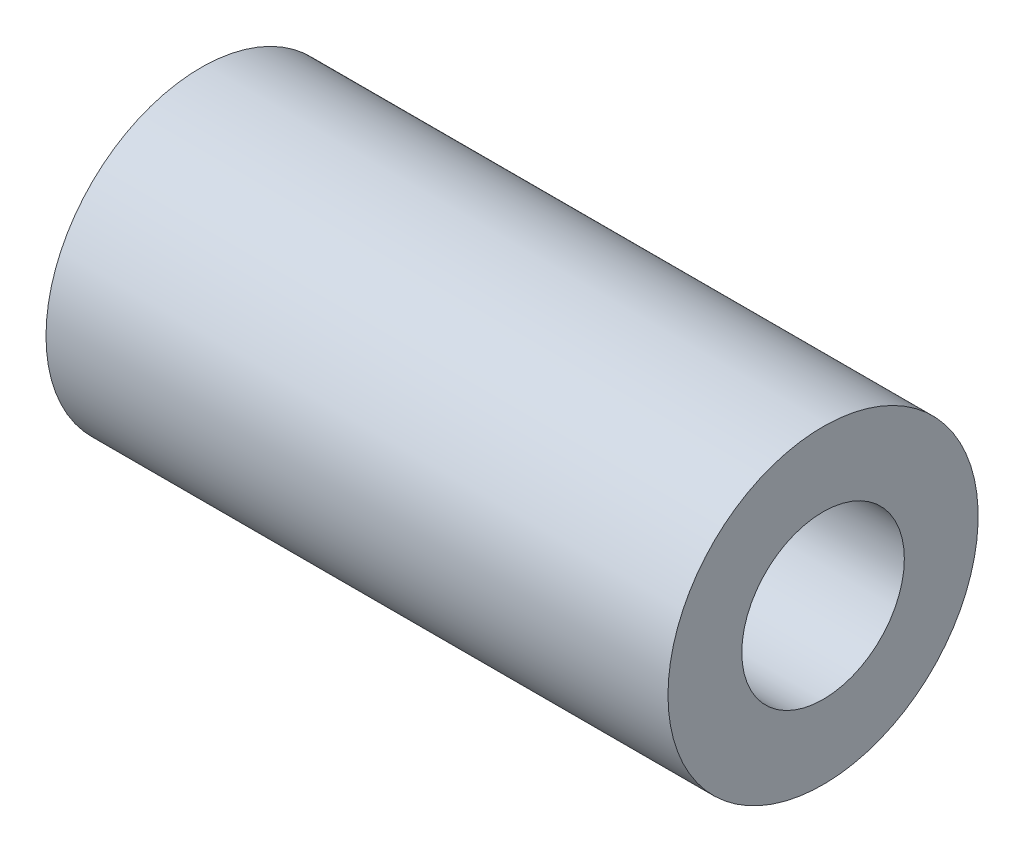
ISO-10303-21;
HEADER;
FILE_DESCRIPTION(('STEP AP214'),'2;1');
FILE_NAME('part.step','',(''),(''),'','','');
FILE_SCHEMA(('AUTOMOTIVE_DESIGN { 1 0 10303 214 1 1 1 1 }'));
ENDSEC;
DATA;
#1=APPLICATION_CONTEXT('core data for automotive mechanical design processes');
#2=APPLICATION_PROTOCOL_DEFINITION('international standard','automotive_design',2000,#1);
#3=PRODUCT_CONTEXT('',#1,'mechanical');
#4=PRODUCT('Part','Part','',(#3));
#5=PRODUCT_RELATED_PRODUCT_CATEGORY('part','',(#4));
#6=PRODUCT_DEFINITION_FORMATION('','',#4);
#7=PRODUCT_DEFINITION_CONTEXT('part definition',#1,'design');
#8=PRODUCT_DEFINITION('design','',#6,#7);
#9=PRODUCT_DEFINITION_SHAPE('','',#8);
#10=(LENGTH_UNIT() NAMED_UNIT(*) SI_UNIT(.MILLI.,.METRE.));
#11=(NAMED_UNIT(*) PLANE_ANGLE_UNIT() SI_UNIT($,.RADIAN.));
#12=(NAMED_UNIT(*) SI_UNIT($,.STERADIAN.) SOLID_ANGLE_UNIT());
#13=UNCERTAINTY_MEASURE_WITH_UNIT(LENGTH_MEASURE(1.E-05),#10,'distance_accuracy_value','');
#14=(GEOMETRIC_REPRESENTATION_CONTEXT(3) GLOBAL_UNCERTAINTY_ASSIGNED_CONTEXT((#13)) GLOBAL_UNIT_ASSIGNED_CONTEXT((#10,
#11,#12)) REPRESENTATION_CONTEXT('',''));
#15=CARTESIAN_POINT('',(0.,0.,0.));
#16=DIRECTION('',(0.,0.,1.));
#17=DIRECTION('',(1.,0.,0.));
#18=AXIS2_PLACEMENT_3D('',#15,#16,#17);
#19=CARTESIAN_POINT('',(9.525,0.,0.));
#20=DIRECTION('',(-1.,0.,0.));
#21=DIRECTION('',(0.,0.,1.));
#22=AXIS2_PLACEMENT_3D('',#19,#20,#21);
#23=CYLINDRICAL_SURFACE('',#22,2.4892);
#24=CARTESIAN_POINT('',(-9.525,0.,0.));
#25=DIRECTION('',(-1.,0.,0.));
#26=DIRECTION('',(0.,0.,1.));
#27=AXIS2_PLACEMENT_3D('',#24,#25,#26);
#28=CIRCLE('',#27,2.4892);
#29=CARTESIAN_POINT('',(-9.525,0.,2.4892));
#30=VERTEX_POINT('',#29);
#31=EDGE_CURVE('E27',#30,#30,#28,.T.);
#32=ORIENTED_EDGE('',*,*,#31,.T.);
#33=EDGE_LOOP('',(#32));
#34=FACE_BOUND('',#33,.T.);
#35=CARTESIAN_POINT('',(9.525,0.,0.));
#36=DIRECTION('',(-1.,0.,0.));
#37=DIRECTION('',(0.,0.,1.));
#38=AXIS2_PLACEMENT_3D('',#35,#36,#37);
#39=CIRCLE('',#38,2.4892);
#40=CARTESIAN_POINT('',(9.525,0.,2.4892));
#41=VERTEX_POINT('',#40);
#42=EDGE_CURVE('E18',#41,#41,#39,.T.);
#43=ORIENTED_EDGE('',*,*,#42,.F.);
#44=EDGE_LOOP('',(#43));
#45=FACE_BOUND('',#44,.T.);
#46=ADVANCED_FACE('F15',(#34,#45),#23,.F.);
#47=CARTESIAN_POINT('',(9.525,0.,0.));
#48=DIRECTION('',(1.,0.,0.));
#49=DIRECTION('',(0.,0.,-1.));
#50=AXIS2_PLACEMENT_3D('',#47,#48,#49);
#51=PLANE('',#50);
#52=ORIENTED_EDGE('',*,*,#42,.T.);
#53=EDGE_LOOP('',(#52));
#54=FACE_BOUND('',#53,.T.);
#55=CARTESIAN_POINT('',(9.525,0.,0.));
#56=DIRECTION('',(-1.,0.,0.));
#57=DIRECTION('',(0.,0.,1.));
#58=AXIS2_PLACEMENT_3D('',#55,#56,#57);
#59=CIRCLE('',#58,4.7498);
#60=CARTESIAN_POINT('',(9.525,0.,4.7498));
#61=VERTEX_POINT('',#60);
#62=EDGE_CURVE('E22',#61,#61,#59,.T.);
#63=ORIENTED_EDGE('',*,*,#62,.F.);
#64=EDGE_LOOP('',(#63));
#65=FACE_BOUND('',#64,.T.);
#66=ADVANCED_FACE('F35',(#54,#65),#51,.T.);
#67=CARTESIAN_POINT('',(-9.525,0.,0.));
#68=DIRECTION('',(1.,0.,0.));
#69=DIRECTION('',(0.,0.,-1.));
#70=AXIS2_PLACEMENT_3D('',#67,#68,#69);
#71=PLANE('',#70);
#72=ORIENTED_EDGE('',*,*,#31,.F.);
#73=EDGE_LOOP('',(#72));
#74=FACE_BOUND('',#73,.T.);
#75=CARTESIAN_POINT('',(-9.525,0.,0.));
#76=DIRECTION('',(-1.,0.,0.));
#77=DIRECTION('',(0.,0.,1.));
#78=AXIS2_PLACEMENT_3D('',#75,#76,#77);
#79=CIRCLE('',#78,4.7498);
#80=CARTESIAN_POINT('',(-9.525,0.,4.7498));
#81=VERTEX_POINT('',#80);
#82=EDGE_CURVE('E10',#81,#81,#79,.F.);
#83=ORIENTED_EDGE('',*,*,#82,.F.);
#84=EDGE_LOOP('',(#83));
#85=FACE_BOUND('',#84,.T.);
#86=ADVANCED_FACE('F43',(#74,#85),#71,.F.);
#87=CARTESIAN_POINT('',(9.525,0.,0.));
#88=DIRECTION('',(-1.,0.,0.));
#89=DIRECTION('',(0.,0.,1.));
#90=AXIS2_PLACEMENT_3D('',#87,#88,#89);
#91=CYLINDRICAL_SURFACE('',#90,4.7498);
#92=ORIENTED_EDGE('',*,*,#82,.T.);
#93=EDGE_LOOP('',(#92));
#94=FACE_BOUND('',#93,.T.);
#95=ORIENTED_EDGE('',*,*,#62,.T.);
#96=EDGE_LOOP('',(#95));
#97=FACE_BOUND('',#96,.T.);
#98=ADVANCED_FACE('F44',(#94,#97),#91,.T.);
#99=CLOSED_SHELL('',(#46,#66,#86,#98));
#100=MANIFOLD_SOLID_BREP('B1',#99);
#101=ADVANCED_BREP_SHAPE_REPRESENTATION('',(#18,#100),#14);
#102=SHAPE_DEFINITION_REPRESENTATION(#9,#101);
ENDSEC;
END-ISO-10303-21;
